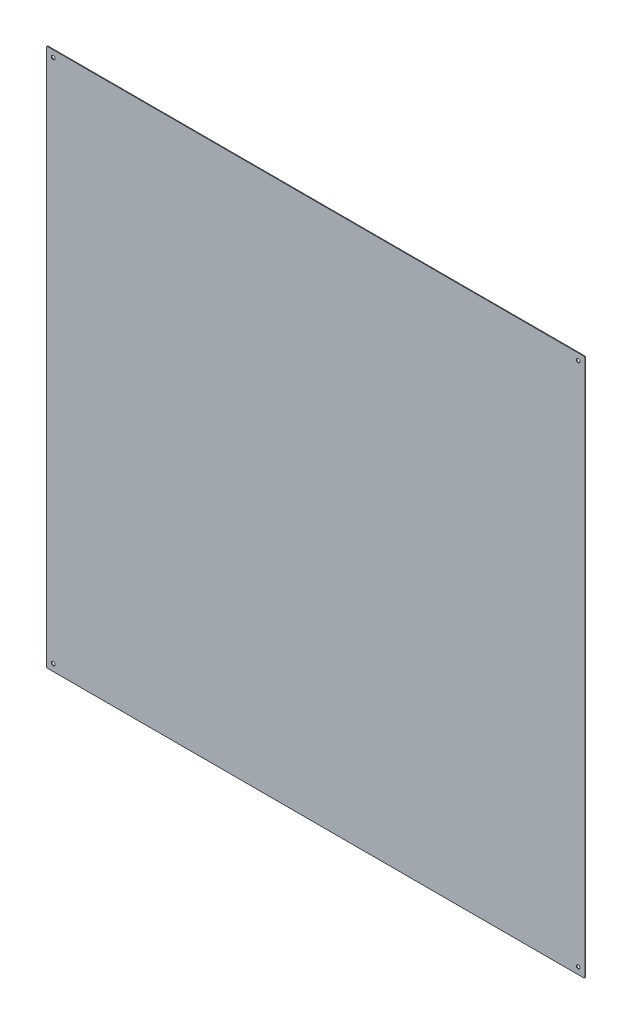
ISO-10303-21;
HEADER;
FILE_DESCRIPTION(('STEP AP214'),'2;1');
FILE_NAME('part.step','',(''),(''),'','','');
FILE_SCHEMA(('AUTOMOTIVE_DESIGN { 1 0 10303 214 1 1 1 1 }'));
ENDSEC;
DATA;
#1=APPLICATION_CONTEXT('core data for automotive mechanical design processes');
#2=APPLICATION_PROTOCOL_DEFINITION('international standard','automotive_design',2000,#1);
#3=PRODUCT_CONTEXT('',#1,'mechanical');
#4=PRODUCT('Part','Part','',(#3));
#5=PRODUCT_RELATED_PRODUCT_CATEGORY('part','',(#4));
#6=PRODUCT_DEFINITION_FORMATION('','',#4);
#7=PRODUCT_DEFINITION_CONTEXT('part definition',#1,'design');
#8=PRODUCT_DEFINITION('design','',#6,#7);
#9=PRODUCT_DEFINITION_SHAPE('','',#8);
#10=(LENGTH_UNIT() NAMED_UNIT(*) SI_UNIT(.MILLI.,.METRE.));
#11=(NAMED_UNIT(*) PLANE_ANGLE_UNIT() SI_UNIT($,.RADIAN.));
#12=(NAMED_UNIT(*) SI_UNIT($,.STERADIAN.) SOLID_ANGLE_UNIT());
#13=UNCERTAINTY_MEASURE_WITH_UNIT(LENGTH_MEASURE(1.E-05),#10,'distance_accuracy_value','');
#14=(GEOMETRIC_REPRESENTATION_CONTEXT(3) GLOBAL_UNCERTAINTY_ASSIGNED_CONTEXT((#13)) GLOBAL_UNIT_ASSIGNED_CONTEXT((#10,
#11,#12)) REPRESENTATION_CONTEXT('',''));
#15=CARTESIAN_POINT('',(0.,0.,0.));
#16=DIRECTION('',(0.,0.,1.));
#17=DIRECTION('',(1.,0.,0.));
#18=AXIS2_PLACEMENT_3D('',#15,#16,#17);
#19=CARTESIAN_POINT('',(602.500000000001,602.5,7.5));
#20=DIRECTION('',(-1.,0.,0.));
#21=DIRECTION('',(0.,-1.,0.));
#22=AXIS2_PLACEMENT_3D('',#19,#20,#21);
#23=PLANE('',#22);
#24=DIRECTION('',(0.,1.,0.));
#25=VECTOR('',#24,1.);
#26=CARTESIAN_POINT('',(602.500000000001,602.5,6.));
#27=LINE('',#26,#25);
#28=CARTESIAN_POINT('',(602.500000000001,-599.5,6.));
#29=VERTEX_POINT('',#28);
#30=CARTESIAN_POINT('',(602.500000000001,599.5,6.));
#31=VERTEX_POINT('',#30);
#32=EDGE_CURVE('E138',#29,#31,#27,.T.);
#33=ORIENTED_EDGE('',*,*,#32,.T.);
#34=DIRECTION('',(0.,0.,-1.));
#35=VECTOR('',#34,1.);
#36=CARTESIAN_POINT('',(602.500000000001,599.5,7.5));
#37=LINE('',#36,#35);
#38=CARTESIAN_POINT('',(602.500000000001,599.5,7.5));
#39=VERTEX_POINT('',#38);
#40=EDGE_CURVE('E171',#31,#39,#37,.F.);
#41=ORIENTED_EDGE('',*,*,#40,.T.);
#42=DIRECTION('',(0.,1.,0.));
#43=VECTOR('',#42,1.);
#44=CARTESIAN_POINT('',(602.500000000001,602.5,7.5));
#45=LINE('',#44,#43);
#46=CARTESIAN_POINT('',(602.500000000001,-599.5,7.5));
#47=VERTEX_POINT('',#46);
#48=EDGE_CURVE('E135',#47,#39,#45,.T.);
#49=ORIENTED_EDGE('',*,*,#48,.F.);
#50=DIRECTION('',(0.,0.,-1.));
#51=VECTOR('',#50,1.);
#52=CARTESIAN_POINT('',(602.500000000001,-599.5,7.5));
#53=LINE('',#52,#51);
#54=EDGE_CURVE('E167',#47,#29,#53,.T.);
#55=ORIENTED_EDGE('',*,*,#54,.T.);
#56=EDGE_LOOP('',(#33,#41,#49,#55));
#57=FACE_BOUND('',#56,.T.);
#58=ADVANCED_FACE('F36',(#57),#23,.F.);
#59=CARTESIAN_POINT('',(-602.5,602.5,7.5));
#60=DIRECTION('',(0.,-1.,0.));
#61=DIRECTION('',(1.,0.,0.));
#62=AXIS2_PLACEMENT_3D('',#59,#60,#61);
#63=PLANE('',#62);
#64=DIRECTION('',(-1.,0.,0.));
#65=VECTOR('',#64,1.);
#66=CARTESIAN_POINT('',(-602.5,602.5,6.));
#67=LINE('',#66,#65);
#68=CARTESIAN_POINT('',(599.500000000001,602.5,6.));
#69=VERTEX_POINT('',#68);
#70=CARTESIAN_POINT('',(-599.5,602.5,6.));
#71=VERTEX_POINT('',#70);
#72=EDGE_CURVE('E131',#69,#71,#67,.T.);
#73=ORIENTED_EDGE('',*,*,#72,.T.);
#74=DIRECTION('',(0.,0.,-1.));
#75=VECTOR('',#74,1.);
#76=CARTESIAN_POINT('',(-599.5,602.5,7.5));
#77=LINE('',#76,#75);
#78=CARTESIAN_POINT('',(-599.5,602.5,7.5));
#79=VERTEX_POINT('',#78);
#80=EDGE_CURVE('E107',#71,#79,#77,.F.);
#81=ORIENTED_EDGE('',*,*,#80,.T.);
#82=DIRECTION('',(-1.,0.,0.));
#83=VECTOR('',#82,1.);
#84=CARTESIAN_POINT('',(-602.5,602.5,7.5));
#85=LINE('',#84,#83);
#86=CARTESIAN_POINT('',(599.500000000001,602.5,7.5));
#87=VERTEX_POINT('',#86);
#88=EDGE_CURVE('E190',#87,#79,#85,.T.);
#89=ORIENTED_EDGE('',*,*,#88,.F.);
#90=DIRECTION('',(0.,0.,-1.));
#91=VECTOR('',#90,1.);
#92=CARTESIAN_POINT('',(599.500000000001,602.5,7.5));
#93=LINE('',#92,#91);
#94=EDGE_CURVE('E113',#87,#69,#93,.T.);
#95=ORIENTED_EDGE('',*,*,#94,.T.);
#96=EDGE_LOOP('',(#73,#81,#89,#95));
#97=FACE_BOUND('',#96,.T.);
#98=ADVANCED_FACE('F261',(#97),#63,.F.);
#99=CARTESIAN_POINT('',(-602.5,602.5,7.5));
#100=DIRECTION('',(1.,0.,0.));
#101=DIRECTION('',(0.,1.,0.));
#102=AXIS2_PLACEMENT_3D('',#99,#100,#101);
#103=PLANE('',#102);
#104=DIRECTION('',(0.,-1.,0.));
#105=VECTOR('',#104,1.);
#106=CARTESIAN_POINT('',(-602.5,602.5,7.5));
#107=LINE('',#106,#105);
#108=CARTESIAN_POINT('',(-602.5,599.5,7.5));
#109=VERTEX_POINT('',#108);
#110=CARTESIAN_POINT('',(-602.499999999999,-599.5,7.5));
#111=VERTEX_POINT('',#110);
#112=EDGE_CURVE('E122',#109,#111,#107,.T.);
#113=ORIENTED_EDGE('',*,*,#112,.F.);
#114=DIRECTION('',(0.,0.,-1.));
#115=VECTOR('',#114,1.);
#116=CARTESIAN_POINT('',(-602.5,599.5,7.5));
#117=LINE('',#116,#115);
#118=CARTESIAN_POINT('',(-602.5,599.5,6.));
#119=VERTEX_POINT('',#118);
#120=EDGE_CURVE('E106',#109,#119,#117,.T.);
#121=ORIENTED_EDGE('',*,*,#120,.T.);
#122=DIRECTION('',(0.,-1.,0.));
#123=VECTOR('',#122,1.);
#124=CARTESIAN_POINT('',(-602.5,602.5,6.));
#125=LINE('',#124,#123);
#126=CARTESIAN_POINT('',(-602.499999999999,-599.5,6.));
#127=VERTEX_POINT('',#126);
#128=EDGE_CURVE('E120',#119,#127,#125,.T.);
#129=ORIENTED_EDGE('',*,*,#128,.T.);
#130=DIRECTION('',(0.,0.,-1.));
#131=VECTOR('',#130,1.);
#132=CARTESIAN_POINT('',(-602.499999999999,-599.5,7.5));
#133=LINE('',#132,#131);
#134=EDGE_CURVE('E125',#127,#111,#133,.F.);
#135=ORIENTED_EDGE('',*,*,#134,.T.);
#136=EDGE_LOOP('',(#113,#121,#129,#135));
#137=FACE_BOUND('',#136,.T.);
#138=ADVANCED_FACE('F119',(#137),#103,.F.);
#139=CARTESIAN_POINT('',(-602.499999999999,-602.5,7.5));
#140=DIRECTION('',(0.,1.,0.));
#141=DIRECTION('',(0.,0.,1.));
#142=AXIS2_PLACEMENT_3D('',#139,#140,#141);
#143=PLANE('',#142);
#144=DIRECTION('',(1.,0.,0.));
#145=VECTOR('',#144,1.);
#146=CARTESIAN_POINT('',(-602.499999999999,-602.5,6.));
#147=LINE('',#146,#145);
#148=CARTESIAN_POINT('',(-599.499999999999,-602.5,6.));
#149=VERTEX_POINT('',#148);
#150=CARTESIAN_POINT('',(599.500000000001,-602.5,6.));
#151=VERTEX_POINT('',#150);
#152=EDGE_CURVE('E130',#149,#151,#147,.T.);
#153=ORIENTED_EDGE('',*,*,#152,.T.);
#154=DIRECTION('',(0.,0.,-1.));
#155=VECTOR('',#154,1.);
#156=CARTESIAN_POINT('',(599.500000000001,-602.5,7.5));
#157=LINE('',#156,#155);
#158=CARTESIAN_POINT('',(599.500000000001,-602.5,7.5));
#159=VERTEX_POINT('',#158);
#160=EDGE_CURVE('E11',#151,#159,#157,.F.);
#161=ORIENTED_EDGE('',*,*,#160,.T.);
#162=DIRECTION('',(1.,0.,0.));
#163=VECTOR('',#162,1.);
#164=CARTESIAN_POINT('',(-602.499999999999,-602.5,7.5));
#165=LINE('',#164,#163);
#166=CARTESIAN_POINT('',(-599.499999999999,-602.5,7.5));
#167=VERTEX_POINT('',#166);
#168=EDGE_CURVE('E143',#167,#159,#165,.T.);
#169=ORIENTED_EDGE('',*,*,#168,.F.);
#170=DIRECTION('',(0.,0.,-1.));
#171=VECTOR('',#170,1.);
#172=CARTESIAN_POINT('',(-599.499999999999,-602.5,7.5));
#173=LINE('',#172,#171);
#174=EDGE_CURVE('E45',#167,#149,#173,.T.);
#175=ORIENTED_EDGE('',*,*,#174,.T.);
#176=EDGE_LOOP('',(#153,#161,#169,#175));
#177=FACE_BOUND('',#176,.T.);
#178=ADVANCED_FACE('F176',(#177),#143,.F.);
#179=CARTESIAN_POINT('',(0.,0.,7.5));
#180=DIRECTION('',(0.,0.,1.));
#181=DIRECTION('',(1.,0.,0.));
#182=AXIS2_PLACEMENT_3D('',#179,#180,#181);
#183=PLANE('',#182);
#184=CARTESIAN_POINT('',(-587.322330470337,587.322330470336,7.5));
#185=DIRECTION('',(0.,0.,-1.));
#186=DIRECTION('',(-1.,0.,0.));
#187=AXIS2_PLACEMENT_3D('',#184,#185,#186);
#188=CIRCLE('',#187,3.99999999999999);
#189=CARTESIAN_POINT('',(-591.322330470337,587.322330470336,7.5));
#190=VERTEX_POINT('',#189);
#191=EDGE_CURVE('E217',#190,#190,#188,.T.);
#192=ORIENTED_EDGE('',*,*,#191,.T.);
#193=EDGE_LOOP('',(#192));
#194=FACE_BOUND('',#193,.T.);
#195=CARTESIAN_POINT('',(587.32233047033,587.322330470342,7.5));
#196=DIRECTION('',(0.,0.,-1.));
#197=DIRECTION('',(-1.,0.,0.));
#198=AXIS2_PLACEMENT_3D('',#195,#196,#197);
#199=CIRCLE('',#198,3.99999999999999);
#200=CARTESIAN_POINT('',(583.32233047033,587.322330470342,7.5));
#201=VERTEX_POINT('',#200);
#202=EDGE_CURVE('E225',#201,#201,#199,.T.);
#203=ORIENTED_EDGE('',*,*,#202,.T.);
#204=EDGE_LOOP('',(#203));
#205=FACE_BOUND('',#204,.T.);
#206=CARTESIAN_POINT('',(587.32233047034,-587.322330470332,7.5));
#207=DIRECTION('',(0.,0.,-1.));
#208=DIRECTION('',(-1.,0.,0.));
#209=AXIS2_PLACEMENT_3D('',#206,#207,#208);
#210=CIRCLE('',#209,3.99999999999999);
#211=CARTESIAN_POINT('',(583.32233047034,-587.322330470332,7.5));
#212=VERTEX_POINT('',#211);
#213=EDGE_CURVE('E212',#212,#212,#210,.T.);
#214=ORIENTED_EDGE('',*,*,#213,.T.);
#215=EDGE_LOOP('',(#214));
#216=FACE_BOUND('',#215,.T.);
#217=CARTESIAN_POINT('',(-587.322330470334,-587.322330470338,7.5));
#218=DIRECTION('',(0.,0.,-1.));
#219=DIRECTION('',(-1.,0.,0.));
#220=AXIS2_PLACEMENT_3D('',#217,#218,#219);
#221=CIRCLE('',#220,3.99999999999999);
#222=CARTESIAN_POINT('',(-591.322330470334,-587.322330470338,7.5));
#223=VERTEX_POINT('',#222);
#224=EDGE_CURVE('E204',#223,#223,#221,.T.);
#225=ORIENTED_EDGE('',*,*,#224,.T.);
#226=EDGE_LOOP('',(#225));
#227=FACE_BOUND('',#226,.T.);
#228=ORIENTED_EDGE('',*,*,#88,.T.);
#229=CARTESIAN_POINT('',(-599.5,599.5,7.5));
#230=DIRECTION('',(0.,0.,1.));
#231=DIRECTION('',(1.,0.,0.));
#232=AXIS2_PLACEMENT_3D('',#229,#230,#231);
#233=CIRCLE('',#232,3.);
#234=EDGE_CURVE('E164',#79,#109,#233,.T.);
#235=ORIENTED_EDGE('',*,*,#234,.T.);
#236=ORIENTED_EDGE('',*,*,#112,.T.);
#237=CARTESIAN_POINT('',(-599.499999999999,-599.5,7.5));
#238=DIRECTION('',(0.,0.,1.));
#239=DIRECTION('',(1.,0.,0.));
#240=AXIS2_PLACEMENT_3D('',#237,#238,#239);
#241=CIRCLE('',#240,3.);
#242=EDGE_CURVE('E57',#111,#167,#241,.T.);
#243=ORIENTED_EDGE('',*,*,#242,.T.);
#244=ORIENTED_EDGE('',*,*,#168,.T.);
#245=CARTESIAN_POINT('',(599.500000000001,-599.5,7.5));
#246=DIRECTION('',(0.,0.,1.));
#247=DIRECTION('',(1.,0.,0.));
#248=AXIS2_PLACEMENT_3D('',#245,#246,#247);
#249=CIRCLE('',#248,3.);
#250=EDGE_CURVE('E158',#159,#47,#249,.T.);
#251=ORIENTED_EDGE('',*,*,#250,.T.);
#252=ORIENTED_EDGE('',*,*,#48,.T.);
#253=CARTESIAN_POINT('',(599.500000000001,599.5,7.5));
#254=DIRECTION('',(0.,0.,1.));
#255=DIRECTION('',(1.,0.,0.));
#256=AXIS2_PLACEMENT_3D('',#253,#254,#255);
#257=CIRCLE('',#256,3.);
#258=EDGE_CURVE('E161',#39,#87,#257,.T.);
#259=ORIENTED_EDGE('',*,*,#258,.T.);
#260=EDGE_LOOP('',(#228,#235,#236,#243,#244,#251,#252,#259));
#261=FACE_BOUND('',#260,.T.);
#262=ADVANCED_FACE('F236',(#194,#205,#216,#227,#261),#183,.T.);
#263=CARTESIAN_POINT('',(0.,0.,6.));
#264=DIRECTION('',(0.,0.,1.));
#265=DIRECTION('',(1.,0.,0.));
#266=AXIS2_PLACEMENT_3D('',#263,#264,#265);
#267=PLANE('',#266);
#268=CARTESIAN_POINT('',(-587.322330470337,587.322330470336,6.));
#269=DIRECTION('',(0.,0.,-1.));
#270=DIRECTION('',(-1.,0.,0.));
#271=AXIS2_PLACEMENT_3D('',#268,#269,#270);
#272=CIRCLE('',#271,3.99999999999999);
#273=CARTESIAN_POINT('',(-591.322330470337,587.322330470336,6.));
#274=VERTEX_POINT('',#273);
#275=EDGE_CURVE('E214',#274,#274,#272,.T.);
#276=ORIENTED_EDGE('',*,*,#275,.F.);
#277=EDGE_LOOP('',(#276));
#278=FACE_BOUND('',#277,.T.);
#279=CARTESIAN_POINT('',(587.32233047033,587.322330470342,6.));
#280=DIRECTION('',(0.,0.,-1.));
#281=DIRECTION('',(-1.,0.,0.));
#282=AXIS2_PLACEMENT_3D('',#279,#280,#281);
#283=CIRCLE('',#282,3.99999999999999);
#284=CARTESIAN_POINT('',(583.32233047033,587.322330470342,6.));
#285=VERTEX_POINT('',#284);
#286=EDGE_CURVE('E221',#285,#285,#283,.T.);
#287=ORIENTED_EDGE('',*,*,#286,.F.);
#288=EDGE_LOOP('',(#287));
#289=FACE_BOUND('',#288,.T.);
#290=CARTESIAN_POINT('',(587.32233047034,-587.322330470332,6.));
#291=DIRECTION('',(0.,0.,-1.));
#292=DIRECTION('',(-1.,0.,0.));
#293=AXIS2_PLACEMENT_3D('',#290,#291,#292);
#294=CIRCLE('',#293,3.99999999999999);
#295=CARTESIAN_POINT('',(583.32233047034,-587.322330470332,6.));
#296=VERTEX_POINT('',#295);
#297=EDGE_CURVE('E229',#296,#296,#294,.T.);
#298=ORIENTED_EDGE('',*,*,#297,.F.);
#299=EDGE_LOOP('',(#298));
#300=FACE_BOUND('',#299,.T.);
#301=CARTESIAN_POINT('',(-587.322330470334,-587.322330470338,6.));
#302=DIRECTION('',(0.,0.,-1.));
#303=DIRECTION('',(-1.,0.,0.));
#304=AXIS2_PLACEMENT_3D('',#301,#302,#303);
#305=CIRCLE('',#304,3.99999999999999);
#306=CARTESIAN_POINT('',(-591.322330470334,-587.322330470338,6.));
#307=VERTEX_POINT('',#306);
#308=EDGE_CURVE('E197',#307,#307,#305,.T.);
#309=ORIENTED_EDGE('',*,*,#308,.F.);
#310=EDGE_LOOP('',(#309));
#311=FACE_BOUND('',#310,.T.);
#312=ORIENTED_EDGE('',*,*,#128,.F.);
#313=CARTESIAN_POINT('',(-599.5,599.5,6.));
#314=DIRECTION('',(0.,0.,1.));
#315=DIRECTION('',(1.,0.,0.));
#316=AXIS2_PLACEMENT_3D('',#313,#314,#315);
#317=CIRCLE('',#316,3.);
#318=EDGE_CURVE('E102',#119,#71,#317,.F.);
#319=ORIENTED_EDGE('',*,*,#318,.T.);
#320=ORIENTED_EDGE('',*,*,#72,.F.);
#321=CARTESIAN_POINT('',(599.500000000001,599.5,6.));
#322=DIRECTION('',(0.,0.,1.));
#323=DIRECTION('',(1.,0.,0.));
#324=AXIS2_PLACEMENT_3D('',#321,#322,#323);
#325=CIRCLE('',#324,3.);
#326=EDGE_CURVE('E114',#69,#31,#325,.F.);
#327=ORIENTED_EDGE('',*,*,#326,.T.);
#328=ORIENTED_EDGE('',*,*,#32,.F.);
#329=CARTESIAN_POINT('',(599.500000000001,-599.5,6.));
#330=DIRECTION('',(0.,0.,1.));
#331=DIRECTION('',(1.,0.,0.));
#332=AXIS2_PLACEMENT_3D('',#329,#330,#331);
#333=CIRCLE('',#332,3.);
#334=EDGE_CURVE('E147',#29,#151,#333,.F.);
#335=ORIENTED_EDGE('',*,*,#334,.T.);
#336=ORIENTED_EDGE('',*,*,#152,.F.);
#337=CARTESIAN_POINT('',(-599.499999999999,-599.5,6.));
#338=DIRECTION('',(0.,0.,1.));
#339=DIRECTION('',(1.,0.,0.));
#340=AXIS2_PLACEMENT_3D('',#337,#338,#339);
#341=CIRCLE('',#340,3.);
#342=EDGE_CURVE('E124',#149,#127,#341,.F.);
#343=ORIENTED_EDGE('',*,*,#342,.T.);
#344=EDGE_LOOP('',(#312,#319,#320,#327,#328,#335,#336,#343));
#345=FACE_BOUND('',#344,.T.);
#346=ADVANCED_FACE('F127',(#278,#289,#300,#311,#345),#267,.F.);
#347=CARTESIAN_POINT('',(-599.5,599.5,7.5));
#348=DIRECTION('',(0.,0.,-1.));
#349=DIRECTION('',(-1.,0.,0.));
#350=AXIS2_PLACEMENT_3D('',#347,#348,#349);
#351=CYLINDRICAL_SURFACE('',#350,3.);
#352=ORIENTED_EDGE('',*,*,#234,.F.);
#353=ORIENTED_EDGE('',*,*,#80,.F.);
#354=ORIENTED_EDGE('',*,*,#318,.F.);
#355=ORIENTED_EDGE('',*,*,#120,.F.);
#356=EDGE_LOOP('',(#352,#353,#354,#355));
#357=FACE_BOUND('',#356,.T.);
#358=ADVANCED_FACE('F105',(#357),#351,.T.);
#359=CARTESIAN_POINT('',(599.500000000001,599.5,7.5));
#360=DIRECTION('',(0.,0.,-1.));
#361=DIRECTION('',(-1.,0.,0.));
#362=AXIS2_PLACEMENT_3D('',#359,#360,#361);
#363=CYLINDRICAL_SURFACE('',#362,3.);
#364=ORIENTED_EDGE('',*,*,#258,.F.);
#365=ORIENTED_EDGE('',*,*,#40,.F.);
#366=ORIENTED_EDGE('',*,*,#326,.F.);
#367=ORIENTED_EDGE('',*,*,#94,.F.);
#368=EDGE_LOOP('',(#364,#365,#366,#367));
#369=FACE_BOUND('',#368,.T.);
#370=ADVANCED_FACE('F272',(#369),#363,.T.);
#371=CARTESIAN_POINT('',(599.500000000001,-599.5,7.5));
#372=DIRECTION('',(0.,0.,-1.));
#373=DIRECTION('',(-1.,0.,0.));
#374=AXIS2_PLACEMENT_3D('',#371,#372,#373);
#375=CYLINDRICAL_SURFACE('',#374,3.);
#376=ORIENTED_EDGE('',*,*,#250,.F.);
#377=ORIENTED_EDGE('',*,*,#160,.F.);
#378=ORIENTED_EDGE('',*,*,#334,.F.);
#379=ORIENTED_EDGE('',*,*,#54,.F.);
#380=EDGE_LOOP('',(#376,#377,#378,#379));
#381=FACE_BOUND('',#380,.T.);
#382=ADVANCED_FACE('F183',(#381),#375,.T.);
#383=CARTESIAN_POINT('',(-599.499999999999,-599.5,7.5));
#384=DIRECTION('',(0.,0.,-1.));
#385=DIRECTION('',(-1.,0.,0.));
#386=AXIS2_PLACEMENT_3D('',#383,#384,#385);
#387=CYLINDRICAL_SURFACE('',#386,3.);
#388=ORIENTED_EDGE('',*,*,#242,.F.);
#389=ORIENTED_EDGE('',*,*,#134,.F.);
#390=ORIENTED_EDGE('',*,*,#342,.F.);
#391=ORIENTED_EDGE('',*,*,#174,.F.);
#392=EDGE_LOOP('',(#388,#389,#390,#391));
#393=FACE_BOUND('',#392,.T.);
#394=ADVANCED_FACE('F38',(#393),#387,.T.);
#395=CARTESIAN_POINT('',(-587.322330470334,-587.322330470338,7.5));
#396=DIRECTION('',(0.,0.,-1.));
#397=DIRECTION('',(-1.,0.,0.));
#398=AXIS2_PLACEMENT_3D('',#395,#396,#397);
#399=CYLINDRICAL_SURFACE('',#398,3.99999999999999);
#400=ORIENTED_EDGE('',*,*,#224,.F.);
#401=EDGE_LOOP('',(#400));
#402=FACE_BOUND('',#401,.T.);
#403=ORIENTED_EDGE('',*,*,#308,.T.);
#404=EDGE_LOOP('',(#403));
#405=FACE_BOUND('',#404,.T.);
#406=ADVANCED_FACE('F242',(#402,#405),#399,.F.);
#407=CARTESIAN_POINT('',(587.32233047034,-587.322330470332,7.5));
#408=DIRECTION('',(0.,0.,-1.));
#409=DIRECTION('',(-1.,0.,0.));
#410=AXIS2_PLACEMENT_3D('',#407,#408,#409);
#411=CYLINDRICAL_SURFACE('',#410,3.99999999999999);
#412=ORIENTED_EDGE('',*,*,#213,.F.);
#413=EDGE_LOOP('',(#412));
#414=FACE_BOUND('',#413,.T.);
#415=ORIENTED_EDGE('',*,*,#297,.T.);
#416=EDGE_LOOP('',(#415));
#417=FACE_BOUND('',#416,.T.);
#418=ADVANCED_FACE('F238',(#414,#417),#411,.F.);
#419=CARTESIAN_POINT('',(587.32233047033,587.322330470342,7.5));
#420=DIRECTION('',(0.,0.,-1.));
#421=DIRECTION('',(-1.,0.,0.));
#422=AXIS2_PLACEMENT_3D('',#419,#420,#421);
#423=CYLINDRICAL_SURFACE('',#422,3.99999999999999);
#424=ORIENTED_EDGE('',*,*,#202,.F.);
#425=EDGE_LOOP('',(#424));
#426=FACE_BOUND('',#425,.T.);
#427=ORIENTED_EDGE('',*,*,#286,.T.);
#428=EDGE_LOOP('',(#427));
#429=FACE_BOUND('',#428,.T.);
#430=ADVANCED_FACE('F241',(#426,#429),#423,.F.);
#431=CARTESIAN_POINT('',(-587.322330470337,587.322330470336,7.5));
#432=DIRECTION('',(0.,0.,-1.));
#433=DIRECTION('',(-1.,0.,0.));
#434=AXIS2_PLACEMENT_3D('',#431,#432,#433);
#435=CYLINDRICAL_SURFACE('',#434,3.99999999999999);
#436=ORIENTED_EDGE('',*,*,#191,.F.);
#437=EDGE_LOOP('',(#436));
#438=FACE_BOUND('',#437,.T.);
#439=ORIENTED_EDGE('',*,*,#275,.T.);
#440=EDGE_LOOP('',(#439));
#441=FACE_BOUND('',#440,.T.);
#442=ADVANCED_FACE('F300',(#438,#441),#435,.F.);
#443=CLOSED_SHELL('',(#58,#98,#138,#178,#262,#346,#358,#370,#382,#394,#406,#418,#430,#442));
#444=MANIFOLD_SOLID_BREP('B2',#443);
#445=ADVANCED_BREP_SHAPE_REPRESENTATION('',(#18,#444),#14);
#446=SHAPE_DEFINITION_REPRESENTATION(#9,#445);
ENDSEC;
END-ISO-10303-21;
